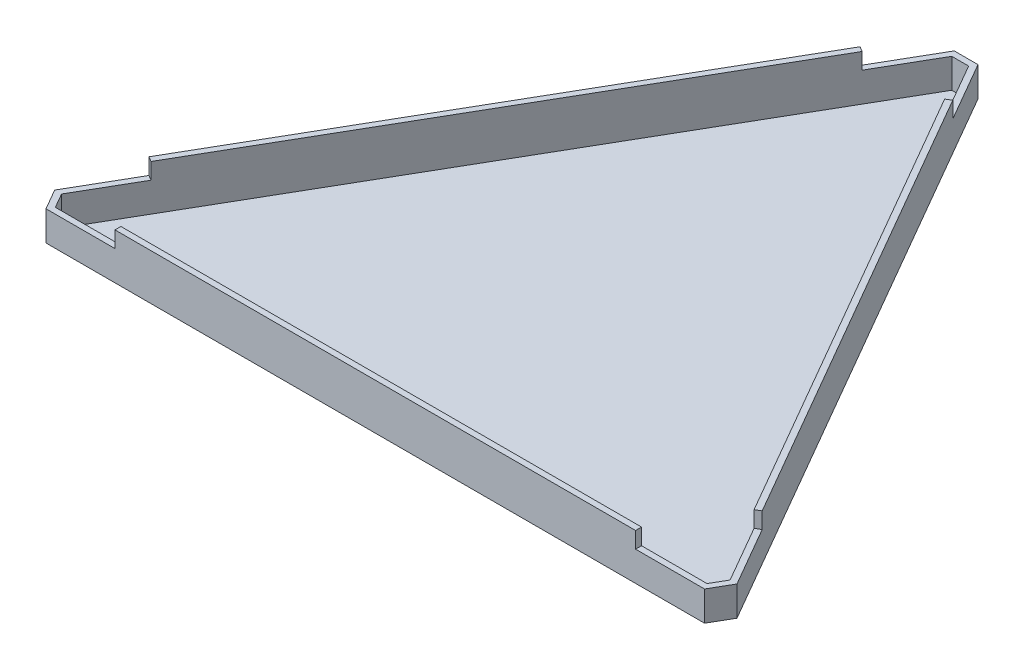
ISO-10303-21;
HEADER;
FILE_DESCRIPTION(('STEP AP214'),'2;1');
FILE_NAME('part.step','',(''),(''),'','','');
FILE_SCHEMA(('AUTOMOTIVE_DESIGN { 1 0 10303 214 1 1 1 1 }'));
ENDSEC;
DATA;
#1=APPLICATION_CONTEXT('core data for automotive mechanical design processes');
#2=APPLICATION_PROTOCOL_DEFINITION('international standard','automotive_design',2000,#1);
#3=PRODUCT_CONTEXT('',#1,'mechanical');
#4=PRODUCT('Part','Part','',(#3));
#5=PRODUCT_RELATED_PRODUCT_CATEGORY('part','',(#4));
#6=PRODUCT_DEFINITION_FORMATION('','',#4);
#7=PRODUCT_DEFINITION_CONTEXT('part definition',#1,'design');
#8=PRODUCT_DEFINITION('design','',#6,#7);
#9=PRODUCT_DEFINITION_SHAPE('','',#8);
#10=(LENGTH_UNIT() NAMED_UNIT(*) SI_UNIT(.MILLI.,.METRE.));
#11=(NAMED_UNIT(*) PLANE_ANGLE_UNIT() SI_UNIT($,.RADIAN.));
#12=(NAMED_UNIT(*) SI_UNIT($,.STERADIAN.) SOLID_ANGLE_UNIT());
#13=UNCERTAINTY_MEASURE_WITH_UNIT(LENGTH_MEASURE(1.E-05),#10,'distance_accuracy_value','');
#14=(GEOMETRIC_REPRESENTATION_CONTEXT(3) GLOBAL_UNCERTAINTY_ASSIGNED_CONTEXT((#13)) GLOBAL_UNIT_ASSIGNED_CONTEXT((#10,
#11,#12)) REPRESENTATION_CONTEXT('',''));
#15=CARTESIAN_POINT('',(0.,0.,0.));
#16=DIRECTION('',(0.,0.,1.));
#17=DIRECTION('',(1.,0.,0.));
#18=AXIS2_PLACEMENT_3D('',#15,#16,#17);
#19=CARTESIAN_POINT('',(0.,0.08,0.));
#20=DIRECTION('',(0.,1.,0.));
#21=DIRECTION('',(0.,0.,1.));
#22=AXIS2_PLACEMENT_3D('',#19,#20,#21);
#23=PLANE('',#22);
#24=DIRECTION('',(0.500000000000268,0.,-0.866025403784284));
#25=VECTOR('',#24,1.);
#26=CARTESIAN_POINT('',(84.5179491924025,0.08,48.7964607176236));
#27=LINE('',#26,#25);
#28=CARTESIAN_POINT('',(109.845299461621,0.0800000000000002,4.92820323027552));
#29=VERTEX_POINT('',#28);
#30=CARTESIAN_POINT('',(112.690598923244,0.0800000000000002,0.));
#31=VERTEX_POINT('',#30);
#32=EDGE_CURVE('E297',#29,#31,#27,.T.);
#33=ORIENTED_EDGE('',*,*,#32,.T.);
#34=DIRECTION('',(-0.49999999999997,0.,-0.866025403784456));
#35=VECTOR('',#34,1.);
#36=CARTESIAN_POINT('',(84.5179491924294,0.08,-48.7964607176003));
#37=LINE('',#36,#35);
#38=CARTESIAN_POINT('',(2.84529946162276,0.08,-190.257639640145));
#39=VERTEX_POINT('',#38);
#40=EDGE_CURVE('E358',#31,#39,#37,.T.);
#41=ORIENTED_EDGE('',*,*,#40,.T.);
#42=DIRECTION('',(-1.,0.,3.02401506656851E-13));
#43=VECTOR('',#42,1.);
#44=CARTESIAN_POINT('',(-5.7534196880156E-11,0.08,-190.257639640144));
#45=LINE('',#44,#43);
#46=CARTESIAN_POINT('',(-2.84529946162175,0.08,-190.257639640144));
#47=VERTEX_POINT('',#46);
#48=EDGE_CURVE('E360',#39,#47,#45,.T.);
#49=ORIENTED_EDGE('',*,*,#48,.T.);
#50=DIRECTION('',(0.499999999999966,0.,-0.866025403784458));
#51=VECTOR('',#50,1.);
#52=CARTESIAN_POINT('',(-84.5179491924274,0.08,-48.7964607175987));
#53=LINE('',#52,#51);
#54=CARTESIAN_POINT('',(-112.690598923241,0.08,0.));
#55=VERTEX_POINT('',#54);
#56=EDGE_CURVE('E50',#55,#47,#53,.T.);
#57=ORIENTED_EDGE('',*,*,#56,.F.);
#58=DIRECTION('',(-0.499999999999998,0.,-0.86602540378444));
#59=VECTOR('',#58,1.);
#60=CARTESIAN_POINT('',(-84.5179491924314,0.08,48.7964607176051));
#61=LINE('',#60,#59);
#62=CARTESIAN_POINT('',(-109.845299461621,0.08,4.92820323027554));
#63=VERTEX_POINT('',#62);
#64=EDGE_CURVE('E54',#63,#55,#61,.T.);
#65=ORIENTED_EDGE('',*,*,#64,.F.);
#66=DIRECTION('',(-1.,0.,0.));
#67=VECTOR('',#66,1.);
#68=CARTESIAN_POINT('',(0.,0.08,4.92820323027566));
#69=LINE('',#68,#67);
#70=EDGE_CURVE('E329',#29,#63,#69,.T.);
#71=ORIENTED_EDGE('',*,*,#70,.F.);
#72=EDGE_LOOP('',(#33,#41,#49,#57,#65,#71));
#73=FACE_BOUND('',#72,.T.);
#74=ADVANCED_FACE('F35',(#73),#23,.T.);
#75=CARTESIAN_POINT('',(-86.25,0.08,49.7964607176052));
#76=DIRECTION('',(0.866025403784439,0.,-0.5));
#77=DIRECTION('',(-0.5,0.,-0.866025403784439));
#78=AXIS2_PLACEMENT_3D('',#75,#76,#77);
#79=PLANE('',#78);
#80=DIRECTION('',(0.5,0.,0.866025403784439));
#81=VECTOR('',#80,1.);
#82=CARTESIAN_POINT('',(-86.25,0.,49.7964607176052));
#83=LINE('',#82,#81);
#84=CARTESIAN_POINT('',(-115.,0.,0.));
#85=VERTEX_POINT('',#84);
#86=CARTESIAN_POINT('',(-111.,0.,6.92820323027554));
#87=VERTEX_POINT('',#86);
#88=EDGE_CURVE('E363',#85,#87,#83,.T.);
#89=ORIENTED_EDGE('',*,*,#88,.T.);
#90=DIRECTION('',(0.,-1.,0.));
#91=VECTOR('',#90,1.);
#92=CARTESIAN_POINT('',(-111.,0.08,6.92820323027554));
#93=LINE('',#92,#91);
#94=CARTESIAN_POINT('',(-111.,10.,6.92820323027554));
#95=VERTEX_POINT('',#94);
#96=EDGE_CURVE('E11',#95,#87,#93,.T.);
#97=ORIENTED_EDGE('',*,*,#96,.F.);
#98=DIRECTION('',(0.5,0.,0.866025403784439));
#99=VECTOR('',#98,1.);
#100=CARTESIAN_POINT('',(-86.25,10.,49.7964607176052));
#101=LINE('',#100,#99);
#102=CARTESIAN_POINT('',(-115.,10.,0.));
#103=VERTEX_POINT('',#102);
#104=EDGE_CURVE('E314',#103,#95,#101,.T.);
#105=ORIENTED_EDGE('',*,*,#104,.F.);
#106=DIRECTION('',(0.,-1.,0.));
#107=VECTOR('',#106,1.);
#108=CARTESIAN_POINT('',(-115.,0.08,0.));
#109=LINE('',#108,#107);
#110=EDGE_CURVE('E378',#103,#85,#109,.T.);
#111=ORIENTED_EDGE('',*,*,#110,.T.);
#112=EDGE_LOOP('',(#89,#97,#105,#111));
#113=FACE_BOUND('',#112,.T.);
#114=ADVANCED_FACE('F37',(#113),#79,.F.);
#115=CARTESIAN_POINT('',(0.,0.08,6.92820323027546));
#116=DIRECTION('',(0.,0.,-1.));
#117=DIRECTION('',(-1.,0.,0.));
#118=AXIS2_PLACEMENT_3D('',#115,#116,#117);
#119=PLANE('',#118);
#120=DIRECTION('',(1.,0.,0.));
#121=VECTOR('',#120,1.);
#122=CARTESIAN_POINT('',(0.,0.,6.92820323027546));
#123=LINE('',#122,#121);
#124=CARTESIAN_POINT('',(111.,0.,6.92820323027546));
#125=VERTEX_POINT('',#124);
#126=EDGE_CURVE('E366',#87,#125,#123,.T.);
#127=ORIENTED_EDGE('',*,*,#126,.T.);
#128=DIRECTION('',(0.,-1.,0.));
#129=VECTOR('',#128,1.);
#130=CARTESIAN_POINT('',(111.,0.08,6.92820323027546));
#131=LINE('',#130,#129);
#132=CARTESIAN_POINT('',(111.,10.,6.92820323027546));
#133=VERTEX_POINT('',#132);
#134=EDGE_CURVE('E43',#133,#125,#131,.T.);
#135=ORIENTED_EDGE('',*,*,#134,.F.);
#136=DIRECTION('',(1.,0.,0.));
#137=VECTOR('',#136,1.);
#138=CARTESIAN_POINT('',(0.,10.,6.92820323027546));
#139=LINE('',#138,#137);
#140=CARTESIAN_POINT('',(87.75,10.,6.92820323027546));
#141=VERTEX_POINT('',#140);
#142=EDGE_CURVE('E282',#141,#133,#139,.T.);
#143=ORIENTED_EDGE('',*,*,#142,.F.);
#144=DIRECTION('',(0.,-1.,0.));
#145=VECTOR('',#144,1.);
#146=CARTESIAN_POINT('',(87.75,15.46,6.92820323027546));
#147=LINE('',#146,#145);
#148=CARTESIAN_POINT('',(87.75,15.46,6.92820323027546));
#149=VERTEX_POINT('',#148);
#150=EDGE_CURVE('E264',#149,#141,#147,.T.);
#151=ORIENTED_EDGE('',*,*,#150,.F.);
#152=DIRECTION('',(1.,0.,0.));
#153=VECTOR('',#152,1.);
#154=CARTESIAN_POINT('',(0.,15.46,6.9282032302755));
#155=LINE('',#154,#153);
#156=CARTESIAN_POINT('',(-87.75,15.46,6.92820323027553));
#157=VERTEX_POINT('',#156);
#158=EDGE_CURVE('E256',#157,#149,#155,.T.);
#159=ORIENTED_EDGE('',*,*,#158,.F.);
#160=DIRECTION('',(0.,-1.,0.));
#161=VECTOR('',#160,1.);
#162=CARTESIAN_POINT('',(-87.75,15.46,6.92820323027553));
#163=LINE('',#162,#161);
#164=CARTESIAN_POINT('',(-87.75,10.,6.92820323027553));
#165=VERTEX_POINT('',#164);
#166=EDGE_CURVE('E266',#157,#165,#163,.T.);
#167=ORIENTED_EDGE('',*,*,#166,.T.);
#168=DIRECTION('',(1.,0.,0.));
#169=VECTOR('',#168,1.);
#170=CARTESIAN_POINT('',(0.,10.,6.9282032302755));
#171=LINE('',#170,#169);
#172=EDGE_CURVE('E317',#95,#165,#171,.T.);
#173=ORIENTED_EDGE('',*,*,#172,.F.);
#174=ORIENTED_EDGE('',*,*,#96,.T.);
#175=EDGE_LOOP('',(#127,#135,#143,#151,#159,#167,#173,#174));
#176=FACE_BOUND('',#175,.T.);
#177=ADVANCED_FACE('F405',(#176),#119,.F.);
#178=CARTESIAN_POINT('',(86.25,0.08,49.7964607176052));
#179=DIRECTION('',(0.866025403784439,0.,0.5));
#180=DIRECTION('',(0.5,0.,-0.866025403784439));
#181=AXIS2_PLACEMENT_3D('',#178,#179,#180);
#182=PLANE('',#181);
#183=DIRECTION('',(-0.5,0.,0.866025403784439));
#184=VECTOR('',#183,1.);
#185=CARTESIAN_POINT('',(86.25,0.,49.7964607176052));
#186=LINE('',#185,#184);
#187=CARTESIAN_POINT('',(115.,0.,0.));
#188=VERTEX_POINT('',#187);
#189=EDGE_CURVE('E368',#188,#125,#186,.T.);
#190=ORIENTED_EDGE('',*,*,#189,.F.);
#191=DIRECTION('',(0.,-1.,0.));
#192=VECTOR('',#191,1.);
#193=CARTESIAN_POINT('',(115.,0.08,0.));
#194=LINE('',#193,#192);
#195=CARTESIAN_POINT('',(115.,10.,0.));
#196=VERTEX_POINT('',#195);
#197=EDGE_CURVE('E385',#196,#188,#194,.T.);
#198=ORIENTED_EDGE('',*,*,#197,.F.);
#199=DIRECTION('',(-0.5,0.,0.866025403784439));
#200=VECTOR('',#199,1.);
#201=CARTESIAN_POINT('',(86.25,10.,49.7964607176052));
#202=LINE('',#201,#200);
#203=EDGE_CURVE('E285',#196,#133,#202,.T.);
#204=ORIENTED_EDGE('',*,*,#203,.T.);
#205=ORIENTED_EDGE('',*,*,#134,.T.);
#206=EDGE_LOOP('',(#190,#198,#204,#205));
#207=FACE_BOUND('',#206,.T.);
#208=ADVANCED_FACE('F390',(#207),#182,.T.);
#209=CARTESIAN_POINT('',(86.2500000000004,0.08,-49.7964607176059));
#210=DIRECTION('',(0.866025403784436,0.,-0.500000000000004));
#211=DIRECTION('',(-0.500000000000004,0.,-0.866025403784437));
#212=AXIS2_PLACEMENT_3D('',#209,#210,#211);
#213=PLANE('',#212);
#214=ORIENTED_EDGE('',*,*,#197,.T.);
#215=DIRECTION('',(0.500000000000004,0.,0.866025403784436));
#216=VECTOR('',#215,1.);
#217=CARTESIAN_POINT('',(86.2500000000004,0.,-49.7964607176059));
#218=LINE('',#217,#216);
#219=CARTESIAN_POINT('',(4.,0.,-192.257639640145));
#220=VERTEX_POINT('',#219);
#221=EDGE_CURVE('E371',#220,#188,#218,.T.);
#222=ORIENTED_EDGE('',*,*,#221,.F.);
#223=DIRECTION('',(0.,-1.,0.));
#224=VECTOR('',#223,1.);
#225=CARTESIAN_POINT('',(4.,0.08,-192.257639640145));
#226=LINE('',#225,#224);
#227=CARTESIAN_POINT('',(4.,10.,-192.257639640145));
#228=VERTEX_POINT('',#227);
#229=EDGE_CURVE('E383',#228,#220,#226,.T.);
#230=ORIENTED_EDGE('',*,*,#229,.F.);
#231=DIRECTION('',(0.500000000000004,0.,0.866025403784436));
#232=VECTOR('',#231,1.);
#233=CARTESIAN_POINT('',(86.2500000000004,10.,-49.7964607176059));
#234=LINE('',#233,#232);
#235=CARTESIAN_POINT('',(15.6250000000031,10.,-172.122549002152));
#236=VERTEX_POINT('',#235);
#237=EDGE_CURVE('E331',#228,#236,#234,.T.);
#238=ORIENTED_EDGE('',*,*,#237,.T.);
#239=DIRECTION('',(0.,-1.,0.));
#240=VECTOR('',#239,1.);
#241=CARTESIAN_POINT('',(15.6250000000031,15.46,-172.122549002152));
#242=LINE('',#241,#240);
#243=CARTESIAN_POINT('',(15.6250000000031,15.46,-172.122549002152));
#244=VERTEX_POINT('',#243);
#245=EDGE_CURVE('E226',#244,#236,#242,.T.);
#246=ORIENTED_EDGE('',*,*,#245,.F.);
#247=DIRECTION('',(0.5,0.,0.866025403784439));
#248=VECTOR('',#247,1.);
#249=CARTESIAN_POINT('',(86.25,15.46,-49.7964607176052));
#250=LINE('',#249,#248);
#251=CARTESIAN_POINT('',(103.375000000003,15.46,-20.1350906379831));
#252=VERTEX_POINT('',#251);
#253=EDGE_CURVE('E219',#244,#252,#250,.T.);
#254=ORIENTED_EDGE('',*,*,#253,.T.);
#255=DIRECTION('',(0.,-1.,0.));
#256=VECTOR('',#255,1.);
#257=CARTESIAN_POINT('',(103.375000000003,15.46,-20.1350906379831));
#258=LINE('',#257,#256);
#259=CARTESIAN_POINT('',(103.375000000003,10.,-20.1350906379831));
#260=VERTEX_POINT('',#259);
#261=EDGE_CURVE('E205',#252,#260,#258,.T.);
#262=ORIENTED_EDGE('',*,*,#261,.T.);
#263=DIRECTION('',(-0.5,0.,-0.866025403784439));
#264=VECTOR('',#263,1.);
#265=CARTESIAN_POINT('',(86.25,10.,-49.7964607176052));
#266=LINE('',#265,#264);
#267=EDGE_CURVE('E288',#196,#260,#266,.T.);
#268=ORIENTED_EDGE('',*,*,#267,.F.);
#269=EDGE_LOOP('',(#214,#222,#230,#238,#246,#254,#262,#268));
#270=FACE_BOUND('',#269,.T.);
#271=ADVANCED_FACE('F401',(#270),#213,.T.);
#272=CARTESIAN_POINT('',(0.,0.08,-192.257639640145));
#273=DIRECTION('',(0.,0.,1.));
#274=DIRECTION('',(1.,0.,0.));
#275=AXIS2_PLACEMENT_3D('',#272,#273,#274);
#276=PLANE('',#275);
#277=DIRECTION('',(-1.,0.,0.));
#278=VECTOR('',#277,1.);
#279=CARTESIAN_POINT('',(0.,0.,-192.257639640145));
#280=LINE('',#279,#278);
#281=CARTESIAN_POINT('',(-4.,0.,-192.257639640145));
#282=VERTEX_POINT('',#281);
#283=EDGE_CURVE('E373',#220,#282,#280,.T.);
#284=ORIENTED_EDGE('',*,*,#283,.T.);
#285=DIRECTION('',(0.,-1.,0.));
#286=VECTOR('',#285,1.);
#287=CARTESIAN_POINT('',(-4.,0.08,-192.257639640145));
#288=LINE('',#287,#286);
#289=CARTESIAN_POINT('',(-4.,10.,-192.257639640145));
#290=VERTEX_POINT('',#289);
#291=EDGE_CURVE('E380',#290,#282,#288,.T.);
#292=ORIENTED_EDGE('',*,*,#291,.F.);
#293=DIRECTION('',(-1.,0.,0.));
#294=VECTOR('',#293,1.);
#295=CARTESIAN_POINT('',(0.,10.,-192.257639640145));
#296=LINE('',#295,#294);
#297=EDGE_CURVE('E334',#228,#290,#296,.T.);
#298=ORIENTED_EDGE('',*,*,#297,.F.);
#299=ORIENTED_EDGE('',*,*,#229,.T.);
#300=EDGE_LOOP('',(#284,#292,#298,#299));
#301=FACE_BOUND('',#300,.T.);
#302=ADVANCED_FACE('F430',(#301),#276,.F.);
#303=CARTESIAN_POINT('',(-86.2500000000002,0.08,-49.7964607176056));
#304=DIRECTION('',(-0.866025403784437,0.,-0.500000000000002));
#305=DIRECTION('',(-0.500000000000002,0.,0.866025403784438));
#306=AXIS2_PLACEMENT_3D('',#303,#304,#305);
#307=PLANE('',#306);
#308=ORIENTED_EDGE('',*,*,#291,.T.);
#309=DIRECTION('',(0.500000000000002,0.,-0.866025403784437));
#310=VECTOR('',#309,1.);
#311=CARTESIAN_POINT('',(-86.2500000000002,0.,-49.7964607176056));
#312=LINE('',#311,#310);
#313=EDGE_CURVE('E376',#85,#282,#312,.T.);
#314=ORIENTED_EDGE('',*,*,#313,.F.);
#315=ORIENTED_EDGE('',*,*,#110,.F.);
#316=DIRECTION('',(0.5,0.,-0.866025403784439));
#317=VECTOR('',#316,1.);
#318=CARTESIAN_POINT('',(-86.25,10.,-49.7964607176052));
#319=LINE('',#318,#317);
#320=CARTESIAN_POINT('',(-103.375,10.,-20.1350906379882));
#321=VERTEX_POINT('',#320);
#322=EDGE_CURVE('E311',#103,#321,#319,.T.);
#323=ORIENTED_EDGE('',*,*,#322,.T.);
#324=DIRECTION('',(0.,-1.,0.));
#325=VECTOR('',#324,1.);
#326=CARTESIAN_POINT('',(-103.375,15.46,-20.1350906379882));
#327=LINE('',#326,#325);
#328=CARTESIAN_POINT('',(-103.375,15.46,-20.1350906379882));
#329=VERTEX_POINT('',#328);
#330=EDGE_CURVE('E242',#329,#321,#327,.T.);
#331=ORIENTED_EDGE('',*,*,#330,.F.);
#332=DIRECTION('',(0.5,0.,-0.866025403784439));
#333=VECTOR('',#332,1.);
#334=CARTESIAN_POINT('',(-86.25,15.46,-49.7964607176052));
#335=LINE('',#334,#333);
#336=CARTESIAN_POINT('',(-15.6250000000001,15.46,-172.122549002157));
#337=VERTEX_POINT('',#336);
#338=EDGE_CURVE('E234',#329,#337,#335,.T.);
#339=ORIENTED_EDGE('',*,*,#338,.T.);
#340=DIRECTION('',(0.,-1.,0.));
#341=VECTOR('',#340,1.);
#342=CARTESIAN_POINT('',(-15.6250000000001,15.46,-172.122549002157));
#343=LINE('',#342,#341);
#344=CARTESIAN_POINT('',(-15.6250000000001,10.,-172.122549002157));
#345=VERTEX_POINT('',#344);
#346=EDGE_CURVE('E245',#337,#345,#343,.T.);
#347=ORIENTED_EDGE('',*,*,#346,.T.);
#348=DIRECTION('',(0.500000000000002,0.,-0.866025403784437));
#349=VECTOR('',#348,1.);
#350=CARTESIAN_POINT('',(-86.2500000000002,10.,-49.7964607176056));
#351=LINE('',#350,#349);
#352=EDGE_CURVE('E337',#345,#290,#351,.T.);
#353=ORIENTED_EDGE('',*,*,#352,.T.);
#354=EDGE_LOOP('',(#308,#314,#315,#323,#331,#339,#347,#353));
#355=FACE_BOUND('',#354,.T.);
#356=ADVANCED_FACE('F427',(#355),#307,.T.);
#357=CARTESIAN_POINT('',(0.,0.,0.));
#358=DIRECTION('',(0.,1.,0.));
#359=DIRECTION('',(0.,0.,1.));
#360=AXIS2_PLACEMENT_3D('',#357,#358,#359);
#361=PLANE('',#360);
#362=ORIENTED_EDGE('',*,*,#221,.T.);
#363=ORIENTED_EDGE('',*,*,#189,.T.);
#364=ORIENTED_EDGE('',*,*,#126,.F.);
#365=ORIENTED_EDGE('',*,*,#88,.F.);
#366=ORIENTED_EDGE('',*,*,#313,.T.);
#367=ORIENTED_EDGE('',*,*,#283,.F.);
#368=EDGE_LOOP('',(#362,#363,#364,#365,#366,#367));
#369=FACE_BOUND('',#368,.T.);
#370=ADVANCED_FACE('F395',(#369),#361,.F.);
#371=CARTESIAN_POINT('',(-84.5179491924274,10.,-48.7964607175987));
#372=DIRECTION('',(0.866025403784458,0.,0.499999999999966));
#373=DIRECTION('',(0.499999999999966,0.,-0.866025403784458));
#374=AXIS2_PLACEMENT_3D('',#371,#372,#373);
#375=PLANE('',#374);
#376=DIRECTION('',(-0.499999999999966,0.,0.866025403784458));
#377=VECTOR('',#376,1.);
#378=CARTESIAN_POINT('',(-84.5179491924274,10.,-48.7964607175987));
#379=LINE('',#378,#377);
#380=CARTESIAN_POINT('',(-2.84529946162175,10.,-190.257639640144));
#381=VERTEX_POINT('',#380);
#382=CARTESIAN_POINT('',(-13.8929491924304,10.,-171.122549002157));
#383=VERTEX_POINT('',#382);
#384=EDGE_CURVE('E342',#381,#383,#379,.T.);
#385=ORIENTED_EDGE('',*,*,#384,.T.);
#386=DIRECTION('',(0.,-1.,0.));
#387=VECTOR('',#386,1.);
#388=CARTESIAN_POINT('',(-13.8929491924304,15.46,-171.122549002157));
#389=LINE('',#388,#387);
#390=CARTESIAN_POINT('',(-13.8929491924304,15.46,-171.122549002157));
#391=VERTEX_POINT('',#390);
#392=EDGE_CURVE('E248',#391,#383,#389,.T.);
#393=ORIENTED_EDGE('',*,*,#392,.F.);
#394=DIRECTION('',(-0.500000000000004,0.,0.866025403784436));
#395=VECTOR('',#394,1.);
#396=CARTESIAN_POINT('',(-84.5179491924307,15.46,-48.7964607176055));
#397=LINE('',#396,#395);
#398=CARTESIAN_POINT('',(-101.642949192431,15.46,-19.1350906379881));
#399=VERTEX_POINT('',#398);
#400=EDGE_CURVE('E204',#391,#399,#397,.T.);
#401=ORIENTED_EDGE('',*,*,#400,.T.);
#402=DIRECTION('',(0.,-1.,0.));
#403=VECTOR('',#402,1.);
#404=CARTESIAN_POINT('',(-101.642949192431,15.46,-19.1350906379881));
#405=LINE('',#404,#403);
#406=CARTESIAN_POINT('',(-101.642949192431,10.,-19.1350906379881));
#407=VERTEX_POINT('',#406);
#408=EDGE_CURVE('E239',#399,#407,#405,.T.);
#409=ORIENTED_EDGE('',*,*,#408,.T.);
#410=DIRECTION('',(0.500000000000005,0.,-0.866025403784436));
#411=VECTOR('',#410,1.);
#412=CARTESIAN_POINT('',(-84.5179491924306,10.,-48.7964607176055));
#413=LINE('',#412,#411);
#414=CARTESIAN_POINT('',(-112.690598923241,10.,0.));
#415=VERTEX_POINT('',#414);
#416=EDGE_CURVE('E306',#415,#407,#413,.T.);
#417=ORIENTED_EDGE('',*,*,#416,.F.);
#418=DIRECTION('',(0.,-1.,0.));
#419=VECTOR('',#418,1.);
#420=CARTESIAN_POINT('',(-112.690598923241,10.,0.));
#421=LINE('',#420,#419);
#422=EDGE_CURVE('E322',#415,#55,#421,.T.);
#423=ORIENTED_EDGE('',*,*,#422,.T.);
#424=ORIENTED_EDGE('',*,*,#56,.T.);
#425=DIRECTION('',(0.,-1.,0.));
#426=VECTOR('',#425,1.);
#427=CARTESIAN_POINT('',(-2.84529946162175,10.,-190.257639640144));
#428=LINE('',#427,#426);
#429=EDGE_CURVE('E355',#381,#47,#428,.T.);
#430=ORIENTED_EDGE('',*,*,#429,.F.);
#431=EDGE_LOOP('',(#385,#393,#401,#409,#417,#423,#424,#430));
#432=FACE_BOUND('',#431,.T.);
#433=ADVANCED_FACE('F445',(#432),#375,.T.);
#434=CARTESIAN_POINT('',(-5.7534196880156E-11,10.,-190.257639640144));
#435=DIRECTION('',(-3.02401506656851E-13,0.,-1.));
#436=DIRECTION('',(-1.,0.,3.02401506656851E-13));
#437=AXIS2_PLACEMENT_3D('',#434,#435,#436);
#438=PLANE('',#437);
#439=ORIENTED_EDGE('',*,*,#48,.F.);
#440=DIRECTION('',(0.,-1.,0.));
#441=VECTOR('',#440,1.);
#442=CARTESIAN_POINT('',(2.84529946162275,10.,-190.257639640145));
#443=LINE('',#442,#441);
#444=CARTESIAN_POINT('',(2.84529946162275,10.,-190.257639640145));
#445=VERTEX_POINT('',#444);
#446=EDGE_CURVE('E352',#445,#39,#443,.T.);
#447=ORIENTED_EDGE('',*,*,#446,.F.);
#448=DIRECTION('',(1.,0.,-3.02401506656851E-13));
#449=VECTOR('',#448,1.);
#450=CARTESIAN_POINT('',(-5.7534196880156E-11,10.,-190.257639640144));
#451=LINE('',#450,#449);
#452=EDGE_CURVE('E345',#381,#445,#451,.T.);
#453=ORIENTED_EDGE('',*,*,#452,.F.);
#454=ORIENTED_EDGE('',*,*,#429,.T.);
#455=EDGE_LOOP('',(#439,#447,#453,#454));
#456=FACE_BOUND('',#455,.T.);
#457=ADVANCED_FACE('F442',(#456),#438,.F.);
#458=CARTESIAN_POINT('',(84.5179491924294,10.,-48.7964607176003));
#459=DIRECTION('',(0.866025403784456,0.,-0.49999999999997));
#460=DIRECTION('',(-0.49999999999997,0.,-0.866025403784456));
#461=AXIS2_PLACEMENT_3D('',#458,#459,#460);
#462=PLANE('',#461);
#463=ORIENTED_EDGE('',*,*,#40,.F.);
#464=DIRECTION('',(0.,-1.,0.));
#465=VECTOR('',#464,1.);
#466=CARTESIAN_POINT('',(112.690598923244,10.,0.));
#467=LINE('',#466,#465);
#468=CARTESIAN_POINT('',(112.690598923244,10.,0.));
#469=VERTEX_POINT('',#468);
#470=EDGE_CURVE('E294',#469,#31,#467,.T.);
#471=ORIENTED_EDGE('',*,*,#470,.F.);
#472=DIRECTION('',(0.500000000000004,0.,0.866025403784437));
#473=VECTOR('',#472,1.);
#474=CARTESIAN_POINT('',(84.5179491924323,10.,-48.7964607176064));
#475=LINE('',#474,#473);
#476=CARTESIAN_POINT('',(101.642949192436,10.,-19.1350906379839));
#477=VERTEX_POINT('',#476);
#478=EDGE_CURVE('E200',#477,#469,#475,.T.);
#479=ORIENTED_EDGE('',*,*,#478,.F.);
#480=DIRECTION('',(0.,-1.,0.));
#481=VECTOR('',#480,1.);
#482=CARTESIAN_POINT('',(101.642949192436,15.46,-19.1350906379839));
#483=LINE('',#482,#481);
#484=CARTESIAN_POINT('',(101.642949192436,15.46,-19.1350906379839));
#485=VERTEX_POINT('',#484);
#486=EDGE_CURVE('E194',#485,#477,#483,.T.);
#487=ORIENTED_EDGE('',*,*,#486,.F.);
#488=DIRECTION('',(-0.500000000000004,0.,-0.866025403784437));
#489=VECTOR('',#488,1.);
#490=CARTESIAN_POINT('',(84.5179491924322,15.46,-48.7964607176064));
#491=LINE('',#490,#489);
#492=CARTESIAN_POINT('',(13.892949192435,15.46,-171.122549002152));
#493=VERTEX_POINT('',#492);
#494=EDGE_CURVE('E198',#485,#493,#491,.T.);
#495=ORIENTED_EDGE('',*,*,#494,.T.);
#496=DIRECTION('',(0.,-1.,0.));
#497=VECTOR('',#496,1.);
#498=CARTESIAN_POINT('',(13.892949192435,15.46,-171.122549002152));
#499=LINE('',#498,#497);
#500=CARTESIAN_POINT('',(13.892949192435,10.,-171.122549002152));
#501=VERTEX_POINT('',#500);
#502=EDGE_CURVE('E224',#493,#501,#499,.T.);
#503=ORIENTED_EDGE('',*,*,#502,.T.);
#504=DIRECTION('',(0.49999999999997,0.,0.866025403784456));
#505=VECTOR('',#504,1.);
#506=CARTESIAN_POINT('',(84.5179491924294,10.,-48.7964607176003));
#507=LINE('',#506,#505);
#508=EDGE_CURVE('E347',#445,#501,#507,.T.);
#509=ORIENTED_EDGE('',*,*,#508,.F.);
#510=ORIENTED_EDGE('',*,*,#446,.T.);
#511=EDGE_LOOP('',(#463,#471,#479,#487,#495,#503,#509,#510));
#512=FACE_BOUND('',#511,.T.);
#513=ADVANCED_FACE('F196',(#512),#462,.F.);
#514=CARTESIAN_POINT('',(0.,10.,0.));
#515=DIRECTION('',(0.,1.,0.));
#516=DIRECTION('',(0.,0.,1.));
#517=AXIS2_PLACEMENT_3D('',#514,#515,#516);
#518=PLANE('',#517);
#519=ORIENTED_EDGE('',*,*,#237,.F.);
#520=ORIENTED_EDGE('',*,*,#297,.T.);
#521=ORIENTED_EDGE('',*,*,#352,.F.);
#522=DIRECTION('',(0.866025403784428,0.,0.500000000000019));
#523=VECTOR('',#522,1.);
#524=CARTESIAN_POINT('',(70.6250000000015,10.,-122.326088284548));
#525=LINE('',#524,#523);
#526=EDGE_CURVE('E340',#345,#383,#525,.T.);
#527=ORIENTED_EDGE('',*,*,#526,.T.);
#528=ORIENTED_EDGE('',*,*,#384,.F.);
#529=ORIENTED_EDGE('',*,*,#452,.T.);
#530=ORIENTED_EDGE('',*,*,#508,.T.);
#531=DIRECTION('',(-0.866025403784433,0.,0.500000000000009));
#532=VECTOR('',#531,1.);
#533=CARTESIAN_POINT('',(-70.6249999999978,10.,-122.326088284545));
#534=LINE('',#533,#532);
#535=EDGE_CURVE('E350',#236,#501,#534,.T.);
#536=ORIENTED_EDGE('',*,*,#535,.F.);
#537=EDGE_LOOP('',(#519,#520,#521,#527,#528,#529,#530,#536));
#538=FACE_BOUND('',#537,.T.);
#539=ADVANCED_FACE('F434',(#538),#518,.T.);
#540=CARTESIAN_POINT('',(0.,10.,4.92820323027566));
#541=DIRECTION('',(0.,0.,-1.));
#542=DIRECTION('',(-1.,0.,0.));
#543=AXIS2_PLACEMENT_3D('',#540,#541,#542);
#544=PLANE('',#543);
#545=DIRECTION('',(1.,0.,0.));
#546=VECTOR('',#545,1.);
#547=CARTESIAN_POINT('',(0.,10.,4.92820323027566));
#548=LINE('',#547,#546);
#549=CARTESIAN_POINT('',(-109.845299461621,10.,4.92820323027554));
#550=VERTEX_POINT('',#549);
#551=CARTESIAN_POINT('',(-87.75,10.,4.92820323027556));
#552=VERTEX_POINT('',#551);
#553=EDGE_CURVE('E300',#550,#552,#548,.T.);
#554=ORIENTED_EDGE('',*,*,#553,.T.);
#555=DIRECTION('',(0.,-1.,0.));
#556=VECTOR('',#555,1.);
#557=CARTESIAN_POINT('',(-87.75,15.46,4.92820323027556));
#558=LINE('',#557,#556);
#559=CARTESIAN_POINT('',(-87.75,15.46,4.92820323027556));
#560=VERTEX_POINT('',#559);
#561=EDGE_CURVE('E269',#560,#552,#558,.T.);
#562=ORIENTED_EDGE('',*,*,#561,.F.);
#563=DIRECTION('',(1.,0.,0.));
#564=VECTOR('',#563,1.);
#565=CARTESIAN_POINT('',(0.,15.46,4.92820323027559));
#566=LINE('',#565,#564);
#567=CARTESIAN_POINT('',(87.75,15.46,4.92820323027563));
#568=VERTEX_POINT('',#567);
#569=EDGE_CURVE('E251',#560,#568,#566,.T.);
#570=ORIENTED_EDGE('',*,*,#569,.T.);
#571=DIRECTION('',(0.,-1.,0.));
#572=VECTOR('',#571,1.);
#573=CARTESIAN_POINT('',(87.75,15.46,4.92820323027563));
#574=LINE('',#573,#572);
#575=CARTESIAN_POINT('',(87.75,10.,4.92820323027563));
#576=VERTEX_POINT('',#575);
#577=EDGE_CURVE('E261',#568,#576,#574,.T.);
#578=ORIENTED_EDGE('',*,*,#577,.T.);
#579=DIRECTION('',(-1.,0.,0.));
#580=VECTOR('',#579,1.);
#581=CARTESIAN_POINT('',(0.,10.,4.92820323027603));
#582=LINE('',#581,#580);
#583=CARTESIAN_POINT('',(109.845299461621,10.,4.92820323027552));
#584=VERTEX_POINT('',#583);
#585=EDGE_CURVE('E276',#584,#576,#582,.T.);
#586=ORIENTED_EDGE('',*,*,#585,.F.);
#587=DIRECTION('',(0.,-1.,0.));
#588=VECTOR('',#587,1.);
#589=CARTESIAN_POINT('',(109.845299461621,10.,4.92820323027552));
#590=LINE('',#589,#588);
#591=EDGE_CURVE('E291',#584,#29,#590,.T.);
#592=ORIENTED_EDGE('',*,*,#591,.T.);
#593=ORIENTED_EDGE('',*,*,#70,.T.);
#594=DIRECTION('',(0.,-1.,0.));
#595=VECTOR('',#594,1.);
#596=CARTESIAN_POINT('',(-109.845299461621,10.,4.92820323027554));
#597=LINE('',#596,#595);
#598=EDGE_CURVE('E325',#550,#63,#597,.T.);
#599=ORIENTED_EDGE('',*,*,#598,.F.);
#600=EDGE_LOOP('',(#554,#562,#570,#578,#586,#592,#593,#599));
#601=FACE_BOUND('',#600,.T.);
#602=ADVANCED_FACE('F451',(#601),#544,.T.);
#603=CARTESIAN_POINT('',(-84.5179491924314,10.,48.7964607176051));
#604=DIRECTION('',(0.86602540378444,0.,-0.499999999999998));
#605=DIRECTION('',(-0.499999999999998,0.,-0.86602540378444));
#606=AXIS2_PLACEMENT_3D('',#603,#604,#605);
#607=PLANE('',#606);
#608=ORIENTED_EDGE('',*,*,#598,.T.);
#609=ORIENTED_EDGE('',*,*,#64,.T.);
#610=ORIENTED_EDGE('',*,*,#422,.F.);
#611=DIRECTION('',(0.499999999999998,0.,0.86602540378444));
#612=VECTOR('',#611,1.);
#613=CARTESIAN_POINT('',(-84.5179491924314,10.,48.7964607176051));
#614=LINE('',#613,#612);
#615=EDGE_CURVE('E303',#415,#550,#614,.T.);
#616=ORIENTED_EDGE('',*,*,#615,.T.);
#617=EDGE_LOOP('',(#608,#609,#610,#616));
#618=FACE_BOUND('',#617,.T.);
#619=ADVANCED_FACE('F449',(#618),#607,.T.);
#620=CARTESIAN_POINT('',(0.,10.,0.));
#621=DIRECTION('',(0.,1.,0.));
#622=DIRECTION('',(0.,0.,1.));
#623=AXIS2_PLACEMENT_3D('',#620,#621,#622);
#624=PLANE('',#623);
#625=ORIENTED_EDGE('',*,*,#553,.F.);
#626=ORIENTED_EDGE('',*,*,#615,.F.);
#627=ORIENTED_EDGE('',*,*,#416,.T.);
#628=DIRECTION('',(0.866025403784437,0.,0.500000000000004));
#629=VECTOR('',#628,1.);
#630=CARTESIAN_POINT('',(-17.1250000000003,10.,29.6613700796173));
#631=LINE('',#630,#629);
#632=EDGE_CURVE('E308',#321,#407,#631,.T.);
#633=ORIENTED_EDGE('',*,*,#632,.F.);
#634=ORIENTED_EDGE('',*,*,#322,.F.);
#635=ORIENTED_EDGE('',*,*,#104,.T.);
#636=ORIENTED_EDGE('',*,*,#172,.T.);
#637=DIRECTION('',(0.,0.,1.));
#638=VECTOR('',#637,1.);
#639=CARTESIAN_POINT('',(-87.75,10.,0.));
#640=LINE('',#639,#638);
#641=EDGE_CURVE('E320',#552,#165,#640,.T.);
#642=ORIENTED_EDGE('',*,*,#641,.F.);
#643=EDGE_LOOP('',(#625,#626,#627,#633,#634,#635,#636,#642));
#644=FACE_BOUND('',#643,.T.);
#645=ADVANCED_FACE('F421',(#644),#624,.T.);
#646=CARTESIAN_POINT('',(84.5179491924025,10.,48.7964607176236));
#647=DIRECTION('',(0.866025403784284,0.,0.500000000000268));
#648=DIRECTION('',(0.500000000000268,0.,-0.866025403784284));
#649=AXIS2_PLACEMENT_3D('',#646,#647,#648);
#650=PLANE('',#649);
#651=ORIENTED_EDGE('',*,*,#32,.F.);
#652=ORIENTED_EDGE('',*,*,#591,.F.);
#653=DIRECTION('',(-0.500000000000268,0.,0.866025403784284));
#654=VECTOR('',#653,1.);
#655=CARTESIAN_POINT('',(84.5179491924025,10.,48.7964607176236));
#656=LINE('',#655,#654);
#657=EDGE_CURVE('E274',#469,#584,#656,.T.);
#658=ORIENTED_EDGE('',*,*,#657,.F.);
#659=ORIENTED_EDGE('',*,*,#470,.T.);
#660=EDGE_LOOP('',(#651,#652,#658,#659));
#661=FACE_BOUND('',#660,.T.);
#662=ADVANCED_FACE('F555',(#661),#650,.F.);
#663=CARTESIAN_POINT('',(0.,10.,0.));
#664=DIRECTION('',(0.,1.,0.));
#665=DIRECTION('',(0.,0.,1.));
#666=AXIS2_PLACEMENT_3D('',#663,#664,#665);
#667=PLANE('',#666);
#668=DIRECTION('',(-0.866025403784438,0.,0.500000000000001));
#669=VECTOR('',#668,1.);
#670=CARTESIAN_POINT('',(17.1250000000031,10.,29.6613700796222));
#671=LINE('',#670,#669);
#672=EDGE_CURVE('E271',#260,#477,#671,.T.);
#673=ORIENTED_EDGE('',*,*,#672,.T.);
#674=ORIENTED_EDGE('',*,*,#478,.T.);
#675=ORIENTED_EDGE('',*,*,#657,.T.);
#676=ORIENTED_EDGE('',*,*,#585,.T.);
#677=DIRECTION('',(0.,0.,1.));
#678=VECTOR('',#677,1.);
#679=CARTESIAN_POINT('',(87.75,10.,0.));
#680=LINE('',#679,#678);
#681=EDGE_CURVE('E279',#576,#141,#680,.T.);
#682=ORIENTED_EDGE('',*,*,#681,.T.);
#683=ORIENTED_EDGE('',*,*,#142,.T.);
#684=ORIENTED_EDGE('',*,*,#203,.F.);
#685=ORIENTED_EDGE('',*,*,#267,.T.);
#686=EDGE_LOOP('',(#673,#674,#675,#676,#682,#683,#684,#685));
#687=FACE_BOUND('',#686,.T.);
#688=ADVANCED_FACE('F403',(#687),#667,.T.);
#689=CARTESIAN_POINT('',(-87.75,15.46,0.));
#690=DIRECTION('',(1.,0.,0.));
#691=DIRECTION('',(0.,0.,-1.));
#692=AXIS2_PLACEMENT_3D('',#689,#690,#691);
#693=PLANE('',#692);
#694=ORIENTED_EDGE('',*,*,#641,.T.);
#695=ORIENTED_EDGE('',*,*,#166,.F.);
#696=DIRECTION('',(0.,0.,1.));
#697=VECTOR('',#696,1.);
#698=CARTESIAN_POINT('',(-87.75,15.46,0.));
#699=LINE('',#698,#697);
#700=EDGE_CURVE('E254',#560,#157,#699,.T.);
#701=ORIENTED_EDGE('',*,*,#700,.F.);
#702=ORIENTED_EDGE('',*,*,#561,.T.);
#703=EDGE_LOOP('',(#694,#695,#701,#702));
#704=FACE_BOUND('',#703,.T.);
#705=ADVANCED_FACE('F416',(#704),#693,.F.);
#706=CARTESIAN_POINT('',(87.75,15.46,0.));
#707=DIRECTION('',(1.,0.,0.));
#708=DIRECTION('',(0.,0.,-1.));
#709=AXIS2_PLACEMENT_3D('',#706,#707,#708);
#710=PLANE('',#709);
#711=ORIENTED_EDGE('',*,*,#150,.T.);
#712=ORIENTED_EDGE('',*,*,#681,.F.);
#713=ORIENTED_EDGE('',*,*,#577,.F.);
#714=DIRECTION('',(0.,0.,1.));
#715=VECTOR('',#714,1.);
#716=CARTESIAN_POINT('',(87.75,15.46,0.));
#717=LINE('',#716,#715);
#718=EDGE_CURVE('E258',#568,#149,#717,.T.);
#719=ORIENTED_EDGE('',*,*,#718,.T.);
#720=EDGE_LOOP('',(#711,#712,#713,#719));
#721=FACE_BOUND('',#720,.T.);
#722=ADVANCED_FACE('F409',(#721),#710,.T.);
#723=CARTESIAN_POINT('',(0.,15.46,0.));
#724=DIRECTION('',(0.,1.,0.));
#725=DIRECTION('',(0.,0.,1.));
#726=AXIS2_PLACEMENT_3D('',#723,#724,#725);
#727=PLANE('',#726);
#728=ORIENTED_EDGE('',*,*,#569,.F.);
#729=ORIENTED_EDGE('',*,*,#700,.T.);
#730=ORIENTED_EDGE('',*,*,#158,.T.);
#731=ORIENTED_EDGE('',*,*,#718,.F.);
#732=EDGE_LOOP('',(#728,#729,#730,#731));
#733=FACE_BOUND('',#732,.T.);
#734=ADVANCED_FACE('F412',(#733),#727,.T.);
#735=CARTESIAN_POINT('',(70.6250000000015,15.46,-122.326088284548));
#736=DIRECTION('',(0.500000000000019,0.,-0.866025403784428));
#737=DIRECTION('',(-0.866025403784428,0.,-0.500000000000019));
#738=AXIS2_PLACEMENT_3D('',#735,#736,#737);
#739=PLANE('',#738);
#740=ORIENTED_EDGE('',*,*,#392,.T.);
#741=ORIENTED_EDGE('',*,*,#526,.F.);
#742=ORIENTED_EDGE('',*,*,#346,.F.);
#743=DIRECTION('',(0.866025403784428,0.,0.500000000000019));
#744=VECTOR('',#743,1.);
#745=CARTESIAN_POINT('',(70.6250000000015,15.46,-122.326088284548));
#746=LINE('',#745,#744);
#747=EDGE_CURVE('E231',#337,#391,#746,.T.);
#748=ORIENTED_EDGE('',*,*,#747,.T.);
#749=EDGE_LOOP('',(#740,#741,#742,#748));
#750=FACE_BOUND('',#749,.T.);
#751=ADVANCED_FACE('F462',(#750),#739,.T.);
#752=CARTESIAN_POINT('',(-17.1250000000003,15.46,29.6613700796173));
#753=DIRECTION('',(0.500000000000003,0.,-0.866025403784437));
#754=DIRECTION('',(-0.866025403784437,0.,-0.500000000000004));
#755=AXIS2_PLACEMENT_3D('',#752,#753,#754);
#756=PLANE('',#755);
#757=ORIENTED_EDGE('',*,*,#632,.T.);
#758=ORIENTED_EDGE('',*,*,#408,.F.);
#759=DIRECTION('',(0.866025403784437,0.,0.500000000000004));
#760=VECTOR('',#759,1.);
#761=CARTESIAN_POINT('',(-17.1250000000003,15.46,29.6613700796173));
#762=LINE('',#761,#760);
#763=EDGE_CURVE('E237',#329,#399,#762,.T.);
#764=ORIENTED_EDGE('',*,*,#763,.F.);
#765=ORIENTED_EDGE('',*,*,#330,.T.);
#766=EDGE_LOOP('',(#757,#758,#764,#765));
#767=FACE_BOUND('',#766,.T.);
#768=ADVANCED_FACE('F454',(#767),#756,.F.);
#769=CARTESIAN_POINT('',(0.,15.46,0.));
#770=DIRECTION('',(0.,1.,0.));
#771=DIRECTION('',(0.,0.,1.));
#772=AXIS2_PLACEMENT_3D('',#769,#770,#771);
#773=PLANE('',#772);
#774=ORIENTED_EDGE('',*,*,#400,.F.);
#775=ORIENTED_EDGE('',*,*,#747,.F.);
#776=ORIENTED_EDGE('',*,*,#338,.F.);
#777=ORIENTED_EDGE('',*,*,#763,.T.);
#778=EDGE_LOOP('',(#774,#775,#776,#777));
#779=FACE_BOUND('',#778,.T.);
#780=ADVANCED_FACE('F459',(#779),#773,.T.);
#781=CARTESIAN_POINT('',(17.1250000000031,15.46,29.6613700796222));
#782=DIRECTION('',(0.500000000000001,0.,0.866025403784438));
#783=DIRECTION('',(0.866025403784438,0.,-0.500000000000001));
#784=AXIS2_PLACEMENT_3D('',#781,#782,#783);
#785=PLANE('',#784);
#786=ORIENTED_EDGE('',*,*,#486,.T.);
#787=ORIENTED_EDGE('',*,*,#672,.F.);
#788=ORIENTED_EDGE('',*,*,#261,.F.);
#789=DIRECTION('',(-0.866025403784438,0.,0.500000000000001));
#790=VECTOR('',#789,1.);
#791=CARTESIAN_POINT('',(17.1250000000031,15.46,29.6613700796222));
#792=LINE('',#791,#790);
#793=EDGE_CURVE('E211',#252,#485,#792,.T.);
#794=ORIENTED_EDGE('',*,*,#793,.T.);
#795=EDGE_LOOP('',(#786,#787,#788,#794));
#796=FACE_BOUND('',#795,.T.);
#797=ADVANCED_FACE('F217',(#796),#785,.T.);
#798=CARTESIAN_POINT('',(-70.6249999999978,15.46,-122.326088284545));
#799=DIRECTION('',(0.500000000000009,0.,0.866025403784433));
#800=DIRECTION('',(0.866025403784433,0.,-0.500000000000009));
#801=AXIS2_PLACEMENT_3D('',#798,#799,#800);
#802=PLANE('',#801);
#803=ORIENTED_EDGE('',*,*,#535,.T.);
#804=ORIENTED_EDGE('',*,*,#502,.F.);
#805=DIRECTION('',(-0.866025403784433,0.,0.500000000000009));
#806=VECTOR('',#805,1.);
#807=CARTESIAN_POINT('',(-70.6249999999978,15.46,-122.326088284545));
#808=LINE('',#807,#806);
#809=EDGE_CURVE('E214',#244,#493,#808,.T.);
#810=ORIENTED_EDGE('',*,*,#809,.F.);
#811=ORIENTED_EDGE('',*,*,#245,.T.);
#812=EDGE_LOOP('',(#803,#804,#810,#811));
#813=FACE_BOUND('',#812,.T.);
#814=ADVANCED_FACE('F437',(#813),#802,.F.);
#815=CARTESIAN_POINT('',(0.,15.46,0.));
#816=DIRECTION('',(0.,1.,0.));
#817=DIRECTION('',(0.,0.,1.));
#818=AXIS2_PLACEMENT_3D('',#815,#816,#817);
#819=PLANE('',#818);
#820=ORIENTED_EDGE('',*,*,#494,.F.);
#821=ORIENTED_EDGE('',*,*,#793,.F.);
#822=ORIENTED_EDGE('',*,*,#253,.F.);
#823=ORIENTED_EDGE('',*,*,#809,.T.);
#824=EDGE_LOOP('',(#820,#821,#822,#823));
#825=FACE_BOUND('',#824,.T.);
#826=ADVANCED_FACE('F209',(#825),#819,.T.);
#827=CLOSED_SHELL('',(#74,#114,#177,#208,#271,#302,#356,#370,#433,#457,#513,#539,#602,#619,#645,
#662,#688,#705,#722,#734,#751,#768,#780,#797,#814,#826));
#828=MANIFOLD_SOLID_BREP('B2',#827);
#829=ADVANCED_BREP_SHAPE_REPRESENTATION('',(#18,#828),#14);
#830=SHAPE_DEFINITION_REPRESENTATION(#9,#829);
ENDSEC;
END-ISO-10303-21;
